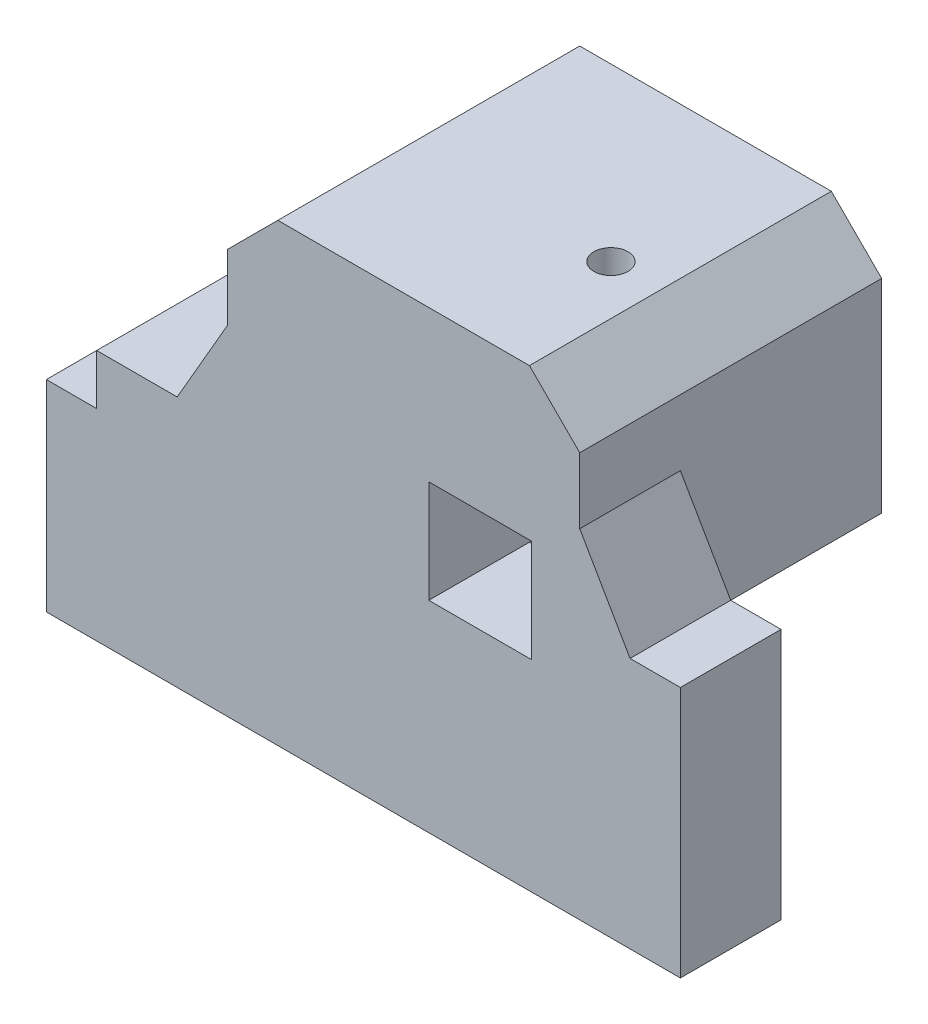
ISO-10303-21;
HEADER;
FILE_DESCRIPTION(('STEP AP214'),'2;1');
FILE_NAME('part.step','',(''),(''),'','','');
FILE_SCHEMA(('AUTOMOTIVE_DESIGN { 1 0 10303 214 1 1 1 1 }'));
ENDSEC;
DATA;
#1=APPLICATION_CONTEXT('core data for automotive mechanical design processes');
#2=APPLICATION_PROTOCOL_DEFINITION('international standard','automotive_design',2000,#1);
#3=PRODUCT_CONTEXT('',#1,'mechanical');
#4=PRODUCT('Part','Part','',(#3));
#5=PRODUCT_RELATED_PRODUCT_CATEGORY('part','',(#4));
#6=PRODUCT_DEFINITION_FORMATION('','',#4);
#7=PRODUCT_DEFINITION_CONTEXT('part definition',#1,'design');
#8=PRODUCT_DEFINITION('design','',#6,#7);
#9=PRODUCT_DEFINITION_SHAPE('','',#8);
#10=(LENGTH_UNIT() NAMED_UNIT(*) SI_UNIT(.MILLI.,.METRE.));
#11=(NAMED_UNIT(*) PLANE_ANGLE_UNIT() SI_UNIT($,.RADIAN.));
#12=(NAMED_UNIT(*) SI_UNIT($,.STERADIAN.) SOLID_ANGLE_UNIT());
#13=UNCERTAINTY_MEASURE_WITH_UNIT(LENGTH_MEASURE(1.E-05),#10,'distance_accuracy_value','');
#14=(GEOMETRIC_REPRESENTATION_CONTEXT(3) GLOBAL_UNCERTAINTY_ASSIGNED_CONTEXT((#13)) GLOBAL_UNIT_ASSIGNED_CONTEXT((#10,
#11,#12)) REPRESENTATION_CONTEXT('',''));
#15=CARTESIAN_POINT('',(0.,0.,0.));
#16=DIRECTION('',(0.,0.,1.));
#17=DIRECTION('',(1.,0.,0.));
#18=AXIS2_PLACEMENT_3D('',#15,#16,#17);
#19=CARTESIAN_POINT('',(-44.8113883008419,15.,0.));
#20=DIRECTION('',(0.,1.,0.));
#21=DIRECTION('',(-1.,0.,0.));
#22=AXIS2_PLACEMENT_3D('',#19,#20,#21);
#23=PLANE('',#22);
#24=DIRECTION('',(1.,0.,0.));
#25=VECTOR('',#24,1.);
#26=CARTESIAN_POINT('',(-44.8113883008419,15.,10.));
#27=LINE('',#26,#25);
#28=CARTESIAN_POINT('',(-29.,15.,10.));
#29=VERTEX_POINT('',#28);
#30=CARTESIAN_POINT('',(-21.,15.,10.));
#31=VERTEX_POINT('',#30);
#32=EDGE_CURVE('E327',#29,#31,#27,.T.);
#33=ORIENTED_EDGE('',*,*,#32,.T.);
#34=DIRECTION('',(0.,0.,-1.));
#35=VECTOR('',#34,1.);
#36=CARTESIAN_POINT('',(-21.,15.,0.));
#37=LINE('',#36,#35);
#38=CARTESIAN_POINT('',(-21.,15.,-5.));
#39=VERTEX_POINT('',#38);
#40=EDGE_CURVE('E374',#31,#39,#37,.T.);
#41=ORIENTED_EDGE('',*,*,#40,.T.);
#42=DIRECTION('',(1.,0.,0.));
#43=VECTOR('',#42,1.);
#44=CARTESIAN_POINT('',(-44.8113883008419,15.,-5.));
#45=LINE('',#44,#43);
#46=CARTESIAN_POINT('',(-29.,15.,-5.));
#47=VERTEX_POINT('',#46);
#48=EDGE_CURVE('E341',#47,#39,#45,.T.);
#49=ORIENTED_EDGE('',*,*,#48,.F.);
#50=DIRECTION('',(0.,0.,-1.));
#51=VECTOR('',#50,1.);
#52=CARTESIAN_POINT('',(-29.,15.,0.));
#53=LINE('',#52,#51);
#54=EDGE_CURVE('E326',#29,#47,#53,.T.);
#55=ORIENTED_EDGE('',*,*,#54,.F.);
#56=EDGE_LOOP('',(#33,#41,#49,#55));
#57=FACE_BOUND('',#56,.T.);
#58=ADVANCED_FACE('F45',(#57),#23,.T.);
#59=DIRECTION('',(1.,0.,0.));
#60=VECTOR('',#59,1.);
#61=CARTESIAN_POINT('',(-44.8113883008419,15.,0.));
#62=LINE('',#61,#60);
#63=CARTESIAN_POINT('',(24.,15.,0.));
#64=VERTEX_POINT('',#63);
#65=CARTESIAN_POINT('',(29.,15.,0.));
#66=VERTEX_POINT('',#65);
#67=EDGE_CURVE('E243',#64,#66,#62,.T.);
#68=ORIENTED_EDGE('',*,*,#67,.F.);
#69=DIRECTION('',(0.,0.,1.));
#70=VECTOR('',#69,1.);
#71=CARTESIAN_POINT('',(24.,15.,10.));
#72=LINE('',#71,#70);
#73=CARTESIAN_POINT('',(24.,15.,10.));
#74=VERTEX_POINT('',#73);
#75=EDGE_CURVE('E372',#64,#74,#72,.T.);
#76=ORIENTED_EDGE('',*,*,#75,.T.);
#77=CARTESIAN_POINT('',(29.,15.,10.));
#78=VERTEX_POINT('',#77);
#79=EDGE_CURVE('E340',#74,#78,#27,.T.);
#80=ORIENTED_EDGE('',*,*,#79,.T.);
#81=DIRECTION('',(0.,0.,1.));
#82=VECTOR('',#81,1.);
#83=CARTESIAN_POINT('',(29.,15.,0.));
#84=LINE('',#83,#82);
#85=EDGE_CURVE('E334',#66,#78,#84,.T.);
#86=ORIENTED_EDGE('',*,*,#85,.F.);
#87=EDGE_LOOP('',(#68,#76,#80,#86));
#88=FACE_BOUND('',#87,.T.);
#89=ADVANCED_FACE('F436',(#88),#23,.T.);
#90=CARTESIAN_POINT('',(-44.8113883008419,0.,-5.));
#91=DIRECTION('',(0.,0.,-1.));
#92=DIRECTION('',(-1.,0.,0.));
#93=AXIS2_PLACEMENT_3D('',#90,#91,#92);
#94=PLANE('',#93);
#95=ORIENTED_EDGE('',*,*,#48,.T.);
#96=DIRECTION('',(0.499999999999995,0.866025403784441,0.));
#97=VECTOR('',#96,1.);
#98=CARTESIAN_POINT('',(-21.,15.,-5.));
#99=LINE('',#98,#97);
#100=CARTESIAN_POINT('',(-16.,23.6602540378445,-5.));
#101=VERTEX_POINT('',#100);
#102=EDGE_CURVE('E54',#39,#101,#99,.T.);
#103=ORIENTED_EDGE('',*,*,#102,.T.);
#104=DIRECTION('',(0.,-1.,0.));
#105=VECTOR('',#104,1.);
#106=CARTESIAN_POINT('',(-16.,0.,-5.));
#107=LINE('',#106,#105);
#108=CARTESIAN_POINT('',(-16.,10.,-5.));
#109=VERTEX_POINT('',#108);
#110=EDGE_CURVE('E61',#101,#109,#107,.T.);
#111=ORIENTED_EDGE('',*,*,#110,.T.);
#112=DIRECTION('',(1.,0.,0.));
#113=VECTOR('',#112,1.);
#114=CARTESIAN_POINT('',(-44.8113883008419,10.,-5.));
#115=LINE('',#114,#113);
#116=CARTESIAN_POINT('',(-29.,10.,-5.));
#117=VERTEX_POINT('',#116);
#118=EDGE_CURVE('E337',#117,#109,#115,.T.);
#119=ORIENTED_EDGE('',*,*,#118,.F.);
#120=DIRECTION('',(0.,-1.,0.));
#121=VECTOR('',#120,1.);
#122=CARTESIAN_POINT('',(-29.,0.,-5.));
#123=LINE('',#122,#121);
#124=EDGE_CURVE('E324',#47,#117,#123,.T.);
#125=ORIENTED_EDGE('',*,*,#124,.F.);
#126=EDGE_LOOP('',(#95,#103,#111,#119,#125));
#127=FACE_BOUND('',#126,.T.);
#128=ADVANCED_FACE('F381',(#127),#94,.T.);
#129=CARTESIAN_POINT('',(-29.,-10.,5.));
#130=DIRECTION('',(1.,0.,0.));
#131=DIRECTION('',(0.,1.,0.));
#132=AXIS2_PLACEMENT_3D('',#129,#130,#131);
#133=PLANE('',#132);
#134=DIRECTION('',(0.,0.,1.));
#135=VECTOR('',#134,1.);
#136=CARTESIAN_POINT('',(-29.,10.,0.));
#137=LINE('',#136,#135);
#138=CARTESIAN_POINT('',(-29.,10.,0.));
#139=VERTEX_POINT('',#138);
#140=EDGE_CURVE('E346',#117,#139,#137,.T.);
#141=ORIENTED_EDGE('',*,*,#140,.T.);
#142=CARTESIAN_POINT('',(-29.,10.,9.99999999999999));
#143=VERTEX_POINT('',#142);
#144=EDGE_CURVE('E331',#139,#143,#137,.T.);
#145=ORIENTED_EDGE('',*,*,#144,.T.);
#146=DIRECTION('',(0.,1.,0.));
#147=VECTOR('',#146,1.);
#148=CARTESIAN_POINT('',(-29.,0.,10.));
#149=LINE('',#148,#147);
#150=EDGE_CURVE('E329',#143,#29,#149,.T.);
#151=ORIENTED_EDGE('',*,*,#150,.T.);
#152=ORIENTED_EDGE('',*,*,#54,.T.);
#153=ORIENTED_EDGE('',*,*,#124,.T.);
#154=EDGE_LOOP('',(#141,#145,#151,#152,#153));
#155=FACE_BOUND('',#154,.T.);
#156=ADVANCED_FACE('F393',(#155),#133,.F.);
#157=CARTESIAN_POINT('',(29.,-10.,5.));
#158=DIRECTION('',(-1.,0.,0.));
#159=DIRECTION('',(0.,-1.,0.));
#160=AXIS2_PLACEMENT_3D('',#157,#158,#159);
#161=PLANE('',#160);
#162=DIRECTION('',(0.,1.,0.));
#163=VECTOR('',#162,1.);
#164=CARTESIAN_POINT('',(29.,-10.,0.));
#165=LINE('',#164,#163);
#166=CARTESIAN_POINT('',(29.,-10.,0.));
#167=VERTEX_POINT('',#166);
#168=EDGE_CURVE('E349',#167,#66,#165,.T.);
#169=ORIENTED_EDGE('',*,*,#168,.T.);
#170=ORIENTED_EDGE('',*,*,#85,.T.);
#171=DIRECTION('',(0.,-1.,0.));
#172=VECTOR('',#171,1.);
#173=CARTESIAN_POINT('',(29.,0.,10.));
#174=LINE('',#173,#172);
#175=CARTESIAN_POINT('',(29.,-10.,9.99999999999999));
#176=VERTEX_POINT('',#175);
#177=EDGE_CURVE('E321',#78,#176,#174,.T.);
#178=ORIENTED_EDGE('',*,*,#177,.T.);
#179=DIRECTION('',(0.,0.,-1.));
#180=VECTOR('',#179,1.);
#181=CARTESIAN_POINT('',(29.,-10.,5.));
#182=LINE('',#181,#180);
#183=EDGE_CURVE('E268',#176,#167,#182,.T.);
#184=ORIENTED_EDGE('',*,*,#183,.T.);
#185=EDGE_LOOP('',(#169,#170,#178,#184));
#186=FACE_BOUND('',#185,.T.);
#187=ADVANCED_FACE('F453',(#186),#161,.F.);
#188=CARTESIAN_POINT('',(-29.,-10.,5.));
#189=DIRECTION('',(0.,1.,0.));
#190=DIRECTION('',(0.,0.,1.));
#191=AXIS2_PLACEMENT_3D('',#188,#189,#190);
#192=PLANE('',#191);
#193=CARTESIAN_POINT('',(-19.,-10.,4.99999999999999));
#194=DIRECTION('',(0.,-1.,0.));
#195=DIRECTION('',(0.,0.,-1.));
#196=AXIS2_PLACEMENT_3D('',#193,#194,#195);
#197=CIRCLE('',#196,2.);
#198=CARTESIAN_POINT('',(-19.,-10.,3.));
#199=VERTEX_POINT('',#198);
#200=EDGE_CURVE('E275',#199,#199,#197,.T.);
#201=ORIENTED_EDGE('',*,*,#200,.F.);
#202=EDGE_LOOP('',(#201));
#203=FACE_BOUND('',#202,.T.);
#204=CARTESIAN_POINT('',(11.,-10.,4.99999999999999));
#205=DIRECTION('',(0.,-1.,0.));
#206=DIRECTION('',(0.,0.,-1.));
#207=AXIS2_PLACEMENT_3D('',#204,#205,#206);
#208=CIRCLE('',#207,2.);
#209=CARTESIAN_POINT('',(11.,-10.,3.));
#210=VERTEX_POINT('',#209);
#211=EDGE_CURVE('E278',#210,#210,#208,.T.);
#212=ORIENTED_EDGE('',*,*,#211,.F.);
#213=EDGE_LOOP('',(#212));
#214=FACE_BOUND('',#213,.T.);
#215=ORIENTED_EDGE('',*,*,#183,.F.);
#216=DIRECTION('',(1.,0.,0.));
#217=VECTOR('',#216,1.);
#218=CARTESIAN_POINT('',(0.,-10.,9.99999999999999));
#219=LINE('',#218,#217);
#220=CARTESIAN_POINT('',(-34.,-10.,9.99999999999999));
#221=VERTEX_POINT('',#220);
#222=EDGE_CURVE('E301',#221,#176,#219,.T.);
#223=ORIENTED_EDGE('',*,*,#222,.F.);
#224=DIRECTION('',(0.,0.,1.));
#225=VECTOR('',#224,1.);
#226=CARTESIAN_POINT('',(-34.,-10.,0.));
#227=LINE('',#226,#225);
#228=CARTESIAN_POINT('',(-34.,-10.,4.99999999999999));
#229=VERTEX_POINT('',#228);
#230=EDGE_CURVE('E315',#229,#221,#227,.T.);
#231=ORIENTED_EDGE('',*,*,#230,.F.);
#232=DIRECTION('',(-0.707106781186548,0.,0.707106781186547));
#233=VECTOR('',#232,1.);
#234=CARTESIAN_POINT('',(-14.5,-10.,-14.5));
#235=LINE('',#234,#233);
#236=CARTESIAN_POINT('',(-29.,-10.,0.));
#237=VERTEX_POINT('',#236);
#238=EDGE_CURVE('E308',#237,#229,#235,.T.);
#239=ORIENTED_EDGE('',*,*,#238,.F.);
#240=DIRECTION('',(1.,0.,0.));
#241=VECTOR('',#240,1.);
#242=CARTESIAN_POINT('',(-29.,-10.,0.));
#243=LINE('',#242,#241);
#244=EDGE_CURVE('E358',#237,#167,#243,.T.);
#245=ORIENTED_EDGE('',*,*,#244,.T.);
#246=EDGE_LOOP('',(#215,#223,#231,#239,#245));
#247=FACE_BOUND('',#246,.T.);
#248=ADVANCED_FACE('F414',(#203,#214,#247),#192,.F.);
#249=CARTESIAN_POINT('',(0.,0.,0.));
#250=DIRECTION('',(0.,0.,-1.));
#251=DIRECTION('',(-1.,0.,0.));
#252=AXIS2_PLACEMENT_3D('',#249,#250,#251);
#253=PLANE('',#252);
#254=ORIENTED_EDGE('',*,*,#168,.F.);
#255=ORIENTED_EDGE('',*,*,#244,.F.);
#256=DIRECTION('',(0.,-1.,0.));
#257=VECTOR('',#256,1.);
#258=CARTESIAN_POINT('',(-29.,-10.,0.));
#259=LINE('',#258,#257);
#260=EDGE_CURVE('E355',#139,#237,#259,.T.);
#261=ORIENTED_EDGE('',*,*,#260,.F.);
#262=DIRECTION('',(-1.,0.,0.));
#263=VECTOR('',#262,1.);
#264=CARTESIAN_POINT('',(-29.,10.,0.));
#265=LINE('',#264,#263);
#266=CARTESIAN_POINT('',(4.,10.,0.));
#267=VERTEX_POINT('',#266);
#268=EDGE_CURVE('E352',#267,#139,#265,.T.);
#269=ORIENTED_EDGE('',*,*,#268,.F.);
#270=CARTESIAN_POINT('',(14.2,10.,0.));
#271=VERTEX_POINT('',#270);
#272=EDGE_CURVE('E356',#271,#267,#265,.T.);
#273=ORIENTED_EDGE('',*,*,#272,.F.);
#274=CARTESIAN_POINT('',(19.,10.,0.));
#275=VERTEX_POINT('',#274);
#276=EDGE_CURVE('E353',#275,#271,#265,.T.);
#277=ORIENTED_EDGE('',*,*,#276,.F.);
#278=DIRECTION('',(0.,-1.,0.));
#279=VECTOR('',#278,1.);
#280=CARTESIAN_POINT('',(19.,20.,0.));
#281=LINE('',#280,#279);
#282=CARTESIAN_POINT('',(19.,23.6602540378445,0.));
#283=VERTEX_POINT('',#282);
#284=EDGE_CURVE('E241',#283,#275,#281,.T.);
#285=ORIENTED_EDGE('',*,*,#284,.F.);
#286=DIRECTION('',(-0.499999999999994,0.866025403784442,0.));
#287=VECTOR('',#286,1.);
#288=CARTESIAN_POINT('',(19.,23.6602540378445,0.));
#289=LINE('',#288,#287);
#290=EDGE_CURVE('E378',#283,#64,#289,.F.);
#291=ORIENTED_EDGE('',*,*,#290,.T.);
#292=ORIENTED_EDGE('',*,*,#67,.T.);
#293=EDGE_LOOP('',(#254,#255,#261,#269,#273,#277,#285,#291,#292));
#294=FACE_BOUND('',#293,.T.);
#295=ADVANCED_FACE('F405',(#294),#253,.T.);
#296=CARTESIAN_POINT('',(-44.8113883008419,0.,10.));
#297=DIRECTION('',(0.,0.,1.));
#298=DIRECTION('',(1.,0.,0.));
#299=AXIS2_PLACEMENT_3D('',#296,#297,#298);
#300=PLANE('',#299);
#301=ORIENTED_EDGE('',*,*,#79,.F.);
#302=DIRECTION('',(0.499999999999994,-0.866025403784442,0.));
#303=VECTOR('',#302,1.);
#304=CARTESIAN_POINT('',(19.,23.6602540378445,10.));
#305=LINE('',#304,#303);
#306=CARTESIAN_POINT('',(19.,23.6602540378445,10.));
#307=VERTEX_POINT('',#306);
#308=EDGE_CURVE('E204',#74,#307,#305,.F.);
#309=ORIENTED_EDGE('',*,*,#308,.T.);
#310=DIRECTION('',(0.,1.,0.));
#311=VECTOR('',#310,1.);
#312=CARTESIAN_POINT('',(19.,15.,10.));
#313=LINE('',#312,#311);
#314=CARTESIAN_POINT('',(19.,30.2,10.));
#315=VERTEX_POINT('',#314);
#316=EDGE_CURVE('E194',#307,#315,#313,.T.);
#317=ORIENTED_EDGE('',*,*,#316,.T.);
#318=DIRECTION('',(-0.70710678118655,0.707106781186545,0.));
#319=VECTOR('',#318,1.);
#320=CARTESIAN_POINT('',(19.,30.2,10.));
#321=LINE('',#320,#319);
#322=CARTESIAN_POINT('',(14.,35.2,10.));
#323=VERTEX_POINT('',#322);
#324=EDGE_CURVE('E201',#315,#323,#321,.T.);
#325=ORIENTED_EDGE('',*,*,#324,.T.);
#326=DIRECTION('',(-1.,0.,0.));
#327=VECTOR('',#326,1.);
#328=CARTESIAN_POINT('',(14.,35.2,10.));
#329=LINE('',#328,#327);
#330=CARTESIAN_POINT('',(-11.,35.2,10.));
#331=VERTEX_POINT('',#330);
#332=EDGE_CURVE('E221',#323,#331,#329,.T.);
#333=ORIENTED_EDGE('',*,*,#332,.T.);
#334=DIRECTION('',(-0.707106781186547,-0.707106781186548,0.));
#335=VECTOR('',#334,1.);
#336=CARTESIAN_POINT('',(-11.,35.2,10.));
#337=LINE('',#336,#335);
#338=CARTESIAN_POINT('',(-16.,30.2,10.));
#339=VERTEX_POINT('',#338);
#340=EDGE_CURVE('E223',#331,#339,#337,.T.);
#341=ORIENTED_EDGE('',*,*,#340,.T.);
#342=DIRECTION('',(0.,-1.,0.));
#343=VECTOR('',#342,1.);
#344=CARTESIAN_POINT('',(-16.,30.2,10.));
#345=LINE('',#344,#343);
#346=CARTESIAN_POINT('',(-16.,23.6602540378445,10.));
#347=VERTEX_POINT('',#346);
#348=EDGE_CURVE('E228',#339,#347,#345,.T.);
#349=ORIENTED_EDGE('',*,*,#348,.T.);
#350=DIRECTION('',(-0.499999999999995,-0.866025403784441,0.));
#351=VECTOR('',#350,1.);
#352=CARTESIAN_POINT('',(-21.,15.,10.));
#353=LINE('',#352,#351);
#354=EDGE_CURVE('E11',#347,#31,#353,.T.);
#355=ORIENTED_EDGE('',*,*,#354,.T.);
#356=ORIENTED_EDGE('',*,*,#32,.F.);
#357=ORIENTED_EDGE('',*,*,#150,.F.);
#358=DIRECTION('',(1.,0.,0.));
#359=VECTOR('',#358,1.);
#360=CARTESIAN_POINT('',(0.,10.,9.99999999999999));
#361=LINE('',#360,#359);
#362=CARTESIAN_POINT('',(-34.,10.,9.99999999999999));
#363=VERTEX_POINT('',#362);
#364=EDGE_CURVE('E304',#363,#143,#361,.T.);
#365=ORIENTED_EDGE('',*,*,#364,.F.);
#366=DIRECTION('',(0.,-1.,0.));
#367=VECTOR('',#366,1.);
#368=CARTESIAN_POINT('',(-34.,10.,9.99999999999999));
#369=LINE('',#368,#367);
#370=EDGE_CURVE('E312',#363,#221,#369,.T.);
#371=ORIENTED_EDGE('',*,*,#370,.T.);
#372=ORIENTED_EDGE('',*,*,#222,.T.);
#373=ORIENTED_EDGE('',*,*,#177,.F.);
#374=EDGE_LOOP('',(#301,#309,#317,#325,#333,#341,#349,#355,#356,#357,#365,#371,#372,#373));
#375=FACE_BOUND('',#374,.T.);
#376=DIRECTION('',(0.,1.,0.));
#377=VECTOR('',#376,1.);
#378=CARTESIAN_POINT('',(14.2,0.,10.));
#379=LINE('',#378,#377);
#380=CARTESIAN_POINT('',(14.2,10.,9.99999999999999));
#381=VERTEX_POINT('',#380);
#382=CARTESIAN_POINT('',(14.2,20.2,10.));
#383=VERTEX_POINT('',#382);
#384=EDGE_CURVE('E287',#381,#383,#379,.T.);
#385=ORIENTED_EDGE('',*,*,#384,.F.);
#386=DIRECTION('',(1.,0.,0.));
#387=VECTOR('',#386,1.);
#388=CARTESIAN_POINT('',(-29.,10.,9.99999999999999));
#389=LINE('',#388,#387);
#390=CARTESIAN_POINT('',(4.,10.,9.99999999999999));
#391=VERTEX_POINT('',#390);
#392=EDGE_CURVE('E274',#391,#381,#389,.T.);
#393=ORIENTED_EDGE('',*,*,#392,.F.);
#394=DIRECTION('',(0.,1.,0.));
#395=VECTOR('',#394,1.);
#396=CARTESIAN_POINT('',(4.,0.,10.));
#397=LINE('',#396,#395);
#398=CARTESIAN_POINT('',(4.,20.2,10.));
#399=VERTEX_POINT('',#398);
#400=EDGE_CURVE('E285',#391,#399,#397,.T.);
#401=ORIENTED_EDGE('',*,*,#400,.T.);
#402=DIRECTION('',(1.,0.,0.));
#403=VECTOR('',#402,1.);
#404=CARTESIAN_POINT('',(4.,20.2,10.));
#405=LINE('',#404,#403);
#406=EDGE_CURVE('E230',#399,#383,#405,.T.);
#407=ORIENTED_EDGE('',*,*,#406,.T.);
#408=EDGE_LOOP('',(#385,#393,#401,#407));
#409=FACE_BOUND('',#408,.T.);
#410=ADVANCED_FACE('F197',(#375,#409),#300,.T.);
#411=CARTESIAN_POINT('',(-44.8113883008419,10.,0.));
#412=DIRECTION('',(0.,-1.,0.));
#413=DIRECTION('',(1.,0.,0.));
#414=AXIS2_PLACEMENT_3D('',#411,#412,#413);
#415=PLANE('',#414);
#416=DIRECTION('',(0.,0.,-1.));
#417=VECTOR('',#416,1.);
#418=CARTESIAN_POINT('',(19.,10.,0.));
#419=LINE('',#418,#417);
#420=CARTESIAN_POINT('',(19.,10.,-20.));
#421=VERTEX_POINT('',#420);
#422=EDGE_CURVE('E239',#275,#421,#419,.T.);
#423=ORIENTED_EDGE('',*,*,#422,.F.);
#424=ORIENTED_EDGE('',*,*,#276,.T.);
#425=DIRECTION('',(0.,0.,1.));
#426=VECTOR('',#425,1.);
#427=CARTESIAN_POINT('',(14.2,10.,-5.));
#428=LINE('',#427,#426);
#429=CARTESIAN_POINT('',(14.2,10.,-15.));
#430=VERTEX_POINT('',#429);
#431=EDGE_CURVE('E290',#430,#271,#428,.T.);
#432=ORIENTED_EDGE('',*,*,#431,.F.);
#433=DIRECTION('',(-1.,0.,0.));
#434=VECTOR('',#433,1.);
#435=CARTESIAN_POINT('',(0.,10.,-15.));
#436=LINE('',#435,#434);
#437=CARTESIAN_POINT('',(4.,10.,-15.));
#438=VERTEX_POINT('',#437);
#439=EDGE_CURVE('E245',#430,#438,#436,.T.);
#440=ORIENTED_EDGE('',*,*,#439,.T.);
#441=DIRECTION('',(0.,0.,1.));
#442=VECTOR('',#441,1.);
#443=CARTESIAN_POINT('',(4.,10.,-5.));
#444=LINE('',#443,#442);
#445=EDGE_CURVE('E295',#438,#267,#444,.T.);
#446=ORIENTED_EDGE('',*,*,#445,.T.);
#447=ORIENTED_EDGE('',*,*,#268,.T.);
#448=ORIENTED_EDGE('',*,*,#140,.F.);
#449=ORIENTED_EDGE('',*,*,#118,.T.);
#450=DIRECTION('',(0.,0.,1.));
#451=VECTOR('',#450,1.);
#452=CARTESIAN_POINT('',(-16.,10.,-15.));
#453=LINE('',#452,#451);
#454=CARTESIAN_POINT('',(-16.,10.,-20.));
#455=VERTEX_POINT('',#454);
#456=EDGE_CURVE('E266',#455,#109,#453,.T.);
#457=ORIENTED_EDGE('',*,*,#456,.F.);
#458=DIRECTION('',(-1.,0.,0.));
#459=VECTOR('',#458,1.);
#460=CARTESIAN_POINT('',(0.,10.,-20.));
#461=LINE('',#460,#459);
#462=EDGE_CURVE('E246',#421,#455,#461,.T.);
#463=ORIENTED_EDGE('',*,*,#462,.F.);
#464=EDGE_LOOP('',(#423,#424,#432,#440,#446,#447,#448,#449,#457,#463));
#465=FACE_BOUND('',#464,.T.);
#466=ADVANCED_FACE('F398',(#465),#415,.T.);
#467=CARTESIAN_POINT('',(0.,10.,0.));
#468=DIRECTION('',(0.,-1.,0.));
#469=DIRECTION('',(0.,0.,-1.));
#470=AXIS2_PLACEMENT_3D('',#467,#468,#469);
#471=PLANE('',#470);
#472=ORIENTED_EDGE('',*,*,#364,.T.);
#473=ORIENTED_EDGE('',*,*,#144,.F.);
#474=DIRECTION('',(-0.707106781186548,0.,0.707106781186547));
#475=VECTOR('',#474,1.);
#476=CARTESIAN_POINT('',(-14.5,10.,-14.5));
#477=LINE('',#476,#475);
#478=CARTESIAN_POINT('',(-34.,10.,4.99999999999999));
#479=VERTEX_POINT('',#478);
#480=EDGE_CURVE('E310',#139,#479,#477,.T.);
#481=ORIENTED_EDGE('',*,*,#480,.T.);
#482=DIRECTION('',(0.,0.,1.));
#483=VECTOR('',#482,1.);
#484=CARTESIAN_POINT('',(-34.,10.,0.));
#485=LINE('',#484,#483);
#486=EDGE_CURVE('E307',#479,#363,#485,.T.);
#487=ORIENTED_EDGE('',*,*,#486,.T.);
#488=EDGE_LOOP('',(#472,#473,#481,#487));
#489=FACE_BOUND('',#488,.T.);
#490=ADVANCED_FACE('F423',(#489),#471,.F.);
#491=CARTESIAN_POINT('',(-14.5,10.,-14.5));
#492=DIRECTION('',(0.707106781186547,0.,0.707106781186548));
#493=DIRECTION('',(0.707106781186548,0.,-0.707106781186547));
#494=AXIS2_PLACEMENT_3D('',#491,#492,#493);
#495=PLANE('',#494);
#496=ORIENTED_EDGE('',*,*,#238,.T.);
#497=DIRECTION('',(0.,-1.,0.));
#498=VECTOR('',#497,1.);
#499=CARTESIAN_POINT('',(-34.,10.,4.99999999999999));
#500=LINE('',#499,#498);
#501=EDGE_CURVE('E318',#479,#229,#500,.T.);
#502=ORIENTED_EDGE('',*,*,#501,.F.);
#503=ORIENTED_EDGE('',*,*,#480,.F.);
#504=ORIENTED_EDGE('',*,*,#260,.T.);
#505=EDGE_LOOP('',(#496,#502,#503,#504));
#506=FACE_BOUND('',#505,.T.);
#507=ADVANCED_FACE('F410',(#506),#495,.F.);
#508=CARTESIAN_POINT('',(-34.,10.,0.));
#509=DIRECTION('',(1.,0.,0.));
#510=DIRECTION('',(0.,0.,-1.));
#511=AXIS2_PLACEMENT_3D('',#508,#509,#510);
#512=PLANE('',#511);
#513=ORIENTED_EDGE('',*,*,#230,.T.);
#514=ORIENTED_EDGE('',*,*,#370,.F.);
#515=ORIENTED_EDGE('',*,*,#486,.F.);
#516=ORIENTED_EDGE('',*,*,#501,.T.);
#517=EDGE_LOOP('',(#513,#514,#515,#516));
#518=FACE_BOUND('',#517,.T.);
#519=ADVANCED_FACE('F418',(#518),#512,.F.);
#520=CARTESIAN_POINT('',(14.2,0.,-5.));
#521=DIRECTION('',(1.,0.,0.));
#522=DIRECTION('',(0.,0.,-1.));
#523=AXIS2_PLACEMENT_3D('',#520,#521,#522);
#524=PLANE('',#523);
#525=DIRECTION('',(0.,0.,1.));
#526=VECTOR('',#525,1.);
#527=CARTESIAN_POINT('',(14.2,20.2,-5.));
#528=LINE('',#527,#526);
#529=CARTESIAN_POINT('',(14.2,20.2,-15.));
#530=VERTEX_POINT('',#529);
#531=EDGE_CURVE('E298',#530,#383,#528,.T.);
#532=ORIENTED_EDGE('',*,*,#531,.F.);
#533=DIRECTION('',(0.,1.,0.));
#534=VECTOR('',#533,1.);
#535=CARTESIAN_POINT('',(14.2,0.,-15.));
#536=LINE('',#535,#534);
#537=EDGE_CURVE('E255',#430,#530,#536,.T.);
#538=ORIENTED_EDGE('',*,*,#537,.F.);
#539=ORIENTED_EDGE('',*,*,#431,.T.);
#540=EDGE_CURVE('E294',#271,#381,#428,.T.);
#541=ORIENTED_EDGE('',*,*,#540,.T.);
#542=ORIENTED_EDGE('',*,*,#384,.T.);
#543=EDGE_LOOP('',(#532,#538,#539,#541,#542));
#544=FACE_BOUND('',#543,.T.);
#545=ADVANCED_FACE('F507',(#544),#524,.F.);
#546=CARTESIAN_POINT('',(0.,20.2,-5.));
#547=DIRECTION('',(0.,1.,0.));
#548=DIRECTION('',(0.,0.,1.));
#549=AXIS2_PLACEMENT_3D('',#546,#547,#548);
#550=PLANE('',#549);
#551=CARTESIAN_POINT('',(9.1,20.2,-3.));
#552=DIRECTION('',(0.,1.,0.));
#553=DIRECTION('',(0.,0.,1.));
#554=AXIS2_PLACEMENT_3D('',#551,#552,#553);
#555=CIRCLE('',#554,1.7);
#556=CARTESIAN_POINT('',(9.1,20.2,-1.3));
#557=VERTEX_POINT('',#556);
#558=EDGE_CURVE('E236',#557,#557,#555,.T.);
#559=ORIENTED_EDGE('',*,*,#558,.T.);
#560=EDGE_LOOP('',(#559));
#561=FACE_BOUND('',#560,.T.);
#562=ORIENTED_EDGE('',*,*,#531,.T.);
#563=ORIENTED_EDGE('',*,*,#406,.F.);
#564=DIRECTION('',(0.,0.,1.));
#565=VECTOR('',#564,1.);
#566=CARTESIAN_POINT('',(4.,20.2,-5.));
#567=LINE('',#566,#565);
#568=CARTESIAN_POINT('',(4.,20.2,-15.));
#569=VERTEX_POINT('',#568);
#570=EDGE_CURVE('E293',#569,#399,#567,.T.);
#571=ORIENTED_EDGE('',*,*,#570,.F.);
#572=DIRECTION('',(-1.,0.,0.));
#573=VECTOR('',#572,1.);
#574=CARTESIAN_POINT('',(0.,20.2,-15.));
#575=LINE('',#574,#573);
#576=EDGE_CURVE('E260',#530,#569,#575,.T.);
#577=ORIENTED_EDGE('',*,*,#576,.F.);
#578=EDGE_LOOP('',(#562,#563,#571,#577));
#579=FACE_BOUND('',#578,.T.);
#580=ADVANCED_FACE('F504',(#561,#579),#550,.F.);
#581=CARTESIAN_POINT('',(4.,0.,-5.));
#582=DIRECTION('',(1.,0.,0.));
#583=DIRECTION('',(0.,0.,-1.));
#584=AXIS2_PLACEMENT_3D('',#581,#582,#583);
#585=PLANE('',#584);
#586=ORIENTED_EDGE('',*,*,#570,.T.);
#587=ORIENTED_EDGE('',*,*,#400,.F.);
#588=EDGE_CURVE('E289',#267,#391,#444,.T.);
#589=ORIENTED_EDGE('',*,*,#588,.F.);
#590=ORIENTED_EDGE('',*,*,#445,.F.);
#591=DIRECTION('',(0.,-1.,0.));
#592=VECTOR('',#591,1.);
#593=CARTESIAN_POINT('',(4.,0.,-15.));
#594=LINE('',#593,#592);
#595=EDGE_CURVE('E263',#569,#438,#594,.T.);
#596=ORIENTED_EDGE('',*,*,#595,.F.);
#597=EDGE_LOOP('',(#586,#587,#589,#590,#596));
#598=FACE_BOUND('',#597,.T.);
#599=ADVANCED_FACE('F495',(#598),#585,.T.);
#600=CARTESIAN_POINT('',(-16.,0.,-5.));
#601=DIRECTION('',(1.,0.,0.));
#602=DIRECTION('',(0.,1.,0.));
#603=AXIS2_PLACEMENT_3D('',#600,#601,#602);
#604=PLANE('',#603);
#605=ORIENTED_EDGE('',*,*,#110,.F.);
#606=DIRECTION('',(0.,0.,1.));
#607=VECTOR('',#606,1.);
#608=CARTESIAN_POINT('',(-16.,23.6602540378445,-5.));
#609=LINE('',#608,#607);
#610=EDGE_CURVE('E66',#101,#347,#609,.T.);
#611=ORIENTED_EDGE('',*,*,#610,.T.);
#612=ORIENTED_EDGE('',*,*,#348,.F.);
#613=DIRECTION('',(0.,0.,-1.));
#614=VECTOR('',#613,1.);
#615=CARTESIAN_POINT('',(-16.,30.2,-5.));
#616=LINE('',#615,#614);
#617=CARTESIAN_POINT('',(-16.,30.2,-20.));
#618=VERTEX_POINT('',#617);
#619=EDGE_CURVE('E368',#339,#618,#616,.T.);
#620=ORIENTED_EDGE('',*,*,#619,.T.);
#621=DIRECTION('',(0.,1.,0.));
#622=VECTOR('',#621,1.);
#623=CARTESIAN_POINT('',(-16.,0.,-20.));
#624=LINE('',#623,#622);
#625=EDGE_CURVE('E248',#455,#618,#624,.T.);
#626=ORIENTED_EDGE('',*,*,#625,.F.);
#627=ORIENTED_EDGE('',*,*,#456,.T.);
#628=EDGE_LOOP('',(#605,#611,#612,#620,#626,#627));
#629=FACE_BOUND('',#628,.T.);
#630=ADVANCED_FACE('F521',(#629),#604,.F.);
#631=CARTESIAN_POINT('',(0.,35.2,-5.));
#632=DIRECTION('',(0.,-1.,0.));
#633=DIRECTION('',(0.,0.,-1.));
#634=AXIS2_PLACEMENT_3D('',#631,#632,#633);
#635=PLANE('',#634);
#636=CARTESIAN_POINT('',(9.1,35.2,-3.));
#637=DIRECTION('',(0.,1.,0.));
#638=DIRECTION('',(0.,0.,1.));
#639=AXIS2_PLACEMENT_3D('',#636,#637,#638);
#640=CIRCLE('',#639,1.7);
#641=CARTESIAN_POINT('',(9.1,35.2,-1.3));
#642=VERTEX_POINT('',#641);
#643=EDGE_CURVE('E233',#642,#642,#640,.T.);
#644=ORIENTED_EDGE('',*,*,#643,.F.);
#645=EDGE_LOOP('',(#644));
#646=FACE_BOUND('',#645,.T.);
#647=DIRECTION('',(0.,0.,1.));
#648=VECTOR('',#647,1.);
#649=CARTESIAN_POINT('',(-11.,35.2,-5.));
#650=LINE('',#649,#648);
#651=CARTESIAN_POINT('',(-11.,35.2,-20.));
#652=VERTEX_POINT('',#651);
#653=EDGE_CURVE('E217',#652,#331,#650,.T.);
#654=ORIENTED_EDGE('',*,*,#653,.T.);
#655=ORIENTED_EDGE('',*,*,#332,.F.);
#656=DIRECTION('',(0.,0.,-1.));
#657=VECTOR('',#656,1.);
#658=CARTESIAN_POINT('',(14.,35.2,-20.));
#659=LINE('',#658,#657);
#660=CARTESIAN_POINT('',(14.,35.2,-20.));
#661=VERTEX_POINT('',#660);
#662=EDGE_CURVE('E220',#323,#661,#659,.T.);
#663=ORIENTED_EDGE('',*,*,#662,.T.);
#664=DIRECTION('',(1.,0.,0.));
#665=VECTOR('',#664,1.);
#666=CARTESIAN_POINT('',(0.,35.2,-20.));
#667=LINE('',#666,#665);
#668=EDGE_CURVE('E251',#652,#661,#667,.T.);
#669=ORIENTED_EDGE('',*,*,#668,.F.);
#670=EDGE_LOOP('',(#654,#655,#663,#669));
#671=FACE_BOUND('',#670,.T.);
#672=ADVANCED_FACE('F524',(#646,#671),#635,.F.);
#673=CARTESIAN_POINT('',(19.,0.,-5.));
#674=DIRECTION('',(1.,0.,0.));
#675=DIRECTION('',(0.,1.,0.));
#676=AXIS2_PLACEMENT_3D('',#673,#674,#675);
#677=PLANE('',#676);
#678=ORIENTED_EDGE('',*,*,#316,.F.);
#679=DIRECTION('',(0.,0.,-1.));
#680=VECTOR('',#679,1.);
#681=CARTESIAN_POINT('',(19.,23.6602540378445,0.));
#682=LINE('',#681,#680);
#683=EDGE_CURVE('E370',#307,#283,#682,.T.);
#684=ORIENTED_EDGE('',*,*,#683,.T.);
#685=ORIENTED_EDGE('',*,*,#284,.T.);
#686=ORIENTED_EDGE('',*,*,#422,.T.);
#687=DIRECTION('',(0.,-1.,0.));
#688=VECTOR('',#687,1.);
#689=CARTESIAN_POINT('',(19.,0.,-20.));
#690=LINE('',#689,#688);
#691=CARTESIAN_POINT('',(19.,30.2,-20.));
#692=VERTEX_POINT('',#691);
#693=EDGE_CURVE('E214',#692,#421,#690,.T.);
#694=ORIENTED_EDGE('',*,*,#693,.F.);
#695=DIRECTION('',(0.,0.,1.));
#696=VECTOR('',#695,1.);
#697=CARTESIAN_POINT('',(19.,30.2,5.));
#698=LINE('',#697,#696);
#699=EDGE_CURVE('E211',#692,#315,#698,.T.);
#700=ORIENTED_EDGE('',*,*,#699,.T.);
#701=EDGE_LOOP('',(#678,#684,#685,#686,#694,#700));
#702=FACE_BOUND('',#701,.T.);
#703=ADVANCED_FACE('F212',(#702),#677,.T.);
#704=CARTESIAN_POINT('',(0.,10.,-5.));
#705=DIRECTION('',(0.,1.,0.));
#706=DIRECTION('',(0.,0.,1.));
#707=AXIS2_PLACEMENT_3D('',#704,#705,#706);
#708=PLANE('',#707);
#709=ORIENTED_EDGE('',*,*,#588,.T.);
#710=ORIENTED_EDGE('',*,*,#392,.T.);
#711=ORIENTED_EDGE('',*,*,#540,.F.);
#712=ORIENTED_EDGE('',*,*,#272,.T.);
#713=EDGE_LOOP('',(#709,#710,#711,#712));
#714=FACE_BOUND('',#713,.T.);
#715=ADVANCED_FACE('F491',(#714),#708,.T.);
#716=CARTESIAN_POINT('',(11.,0.,4.99999999999999));
#717=DIRECTION('',(0.,-1.,0.));
#718=DIRECTION('',(0.,0.,-1.));
#719=AXIS2_PLACEMENT_3D('',#716,#717,#718);
#720=CYLINDRICAL_SURFACE('',#719,2.);
#721=CARTESIAN_POINT('',(11.,0.,4.99999999999999));
#722=DIRECTION('',(0.,-1.,0.));
#723=DIRECTION('',(0.,0.,-1.));
#724=AXIS2_PLACEMENT_3D('',#721,#722,#723);
#725=CIRCLE('',#724,2.);
#726=CARTESIAN_POINT('',(11.,0.,3.));
#727=VERTEX_POINT('',#726);
#728=EDGE_CURVE('E270',#727,#727,#725,.T.);
#729=ORIENTED_EDGE('',*,*,#728,.F.);
#730=EDGE_LOOP('',(#729));
#731=FACE_BOUND('',#730,.T.);
#732=ORIENTED_EDGE('',*,*,#211,.T.);
#733=EDGE_LOOP('',(#732));
#734=FACE_BOUND('',#733,.T.);
#735=ADVANCED_FACE('F529',(#731,#734),#720,.F.);
#736=CARTESIAN_POINT('',(11.,0.,4.99999999999999));
#737=DIRECTION('',(0.,-1.,0.));
#738=DIRECTION('',(0.,0.,-1.));
#739=AXIS2_PLACEMENT_3D('',#736,#737,#738);
#740=PLANE('',#739);
#741=ORIENTED_EDGE('',*,*,#728,.T.);
#742=EDGE_LOOP('',(#741));
#743=FACE_BOUND('',#742,.T.);
#744=ADVANCED_FACE('F533',(#743),#740,.T.);
#745=CARTESIAN_POINT('',(-19.,0.,4.99999999999999));
#746=DIRECTION('',(0.,-1.,0.));
#747=DIRECTION('',(0.,0.,-1.));
#748=AXIS2_PLACEMENT_3D('',#745,#746,#747);
#749=CYLINDRICAL_SURFACE('',#748,2.);
#750=CARTESIAN_POINT('',(-19.,0.,4.99999999999999));
#751=DIRECTION('',(0.,-1.,0.));
#752=DIRECTION('',(0.,0.,-1.));
#753=AXIS2_PLACEMENT_3D('',#750,#751,#752);
#754=CIRCLE('',#753,2.);
#755=CARTESIAN_POINT('',(-19.,0.,3.));
#756=VERTEX_POINT('',#755);
#757=EDGE_CURVE('E271',#756,#756,#754,.T.);
#758=ORIENTED_EDGE('',*,*,#757,.F.);
#759=EDGE_LOOP('',(#758));
#760=FACE_BOUND('',#759,.T.);
#761=ORIENTED_EDGE('',*,*,#200,.T.);
#762=EDGE_LOOP('',(#761));
#763=FACE_BOUND('',#762,.T.);
#764=ADVANCED_FACE('F539',(#760,#763),#749,.F.);
#765=CARTESIAN_POINT('',(-19.,0.,4.99999999999999));
#766=DIRECTION('',(0.,-1.,0.));
#767=DIRECTION('',(0.,0.,-1.));
#768=AXIS2_PLACEMENT_3D('',#765,#766,#767);
#769=PLANE('',#768);
#770=ORIENTED_EDGE('',*,*,#757,.T.);
#771=EDGE_LOOP('',(#770));
#772=FACE_BOUND('',#771,.T.);
#773=ADVANCED_FACE('F546',(#772),#769,.T.);
#774=CARTESIAN_POINT('',(0.,0.,-15.));
#775=DIRECTION('',(0.,0.,-1.));
#776=DIRECTION('',(-1.,0.,0.));
#777=AXIS2_PLACEMENT_3D('',#774,#775,#776);
#778=PLANE('',#777);
#779=ORIENTED_EDGE('',*,*,#439,.F.);
#780=ORIENTED_EDGE('',*,*,#537,.T.);
#781=ORIENTED_EDGE('',*,*,#576,.T.);
#782=ORIENTED_EDGE('',*,*,#595,.T.);
#783=EDGE_LOOP('',(#779,#780,#781,#782));
#784=FACE_BOUND('',#783,.T.);
#785=ADVANCED_FACE('F500',(#784),#778,.F.);
#786=CARTESIAN_POINT('',(0.,0.,-20.));
#787=DIRECTION('',(0.,0.,-1.));
#788=DIRECTION('',(-1.,0.,0.));
#789=AXIS2_PLACEMENT_3D('',#786,#787,#788);
#790=PLANE('',#789);
#791=ORIENTED_EDGE('',*,*,#693,.T.);
#792=ORIENTED_EDGE('',*,*,#462,.T.);
#793=ORIENTED_EDGE('',*,*,#625,.T.);
#794=DIRECTION('',(-0.707106781186547,-0.707106781186548,0.));
#795=VECTOR('',#794,1.);
#796=CARTESIAN_POINT('',(-23.1,23.1,-20.));
#797=LINE('',#796,#795);
#798=EDGE_CURVE('E364',#618,#652,#797,.F.);
#799=ORIENTED_EDGE('',*,*,#798,.T.);
#800=ORIENTED_EDGE('',*,*,#668,.T.);
#801=DIRECTION('',(0.70710678118655,-0.707106781186545,0.));
#802=VECTOR('',#801,1.);
#803=CARTESIAN_POINT('',(24.5999999999999,24.6000000000001,-20.));
#804=LINE('',#803,#802);
#805=EDGE_CURVE('E366',#661,#692,#804,.T.);
#806=ORIENTED_EDGE('',*,*,#805,.T.);
#807=EDGE_LOOP('',(#791,#792,#793,#799,#800,#806));
#808=FACE_BOUND('',#807,.T.);
#809=ADVANCED_FACE('F466',(#808),#790,.T.);
#810=CARTESIAN_POINT('',(19.,30.2,-5.));
#811=DIRECTION('',(0.707106781186545,0.70710678118655,0.));
#812=DIRECTION('',(0.,0.,-1.));
#813=AXIS2_PLACEMENT_3D('',#810,#811,#812);
#814=PLANE('',#813);
#815=ORIENTED_EDGE('',*,*,#805,.F.);
#816=ORIENTED_EDGE('',*,*,#662,.F.);
#817=ORIENTED_EDGE('',*,*,#324,.F.);
#818=ORIENTED_EDGE('',*,*,#699,.F.);
#819=EDGE_LOOP('',(#815,#816,#817,#818));
#820=FACE_BOUND('',#819,.T.);
#821=ADVANCED_FACE('F219',(#820),#814,.T.);
#822=CARTESIAN_POINT('',(-11.,35.2,-5.));
#823=DIRECTION('',(0.707106781186548,-0.707106781186547,0.));
#824=DIRECTION('',(0.,0.,1.));
#825=AXIS2_PLACEMENT_3D('',#822,#823,#824);
#826=PLANE('',#825);
#827=ORIENTED_EDGE('',*,*,#798,.F.);
#828=ORIENTED_EDGE('',*,*,#619,.F.);
#829=ORIENTED_EDGE('',*,*,#340,.F.);
#830=ORIENTED_EDGE('',*,*,#653,.F.);
#831=EDGE_LOOP('',(#827,#828,#829,#830));
#832=FACE_BOUND('',#831,.T.);
#833=ADVANCED_FACE('F465',(#832),#826,.F.);
#834=CARTESIAN_POINT('',(9.1,-9.99999999999999,-3.));
#835=DIRECTION('',(0.,1.,0.));
#836=DIRECTION('',(0.,0.,1.));
#837=AXIS2_PLACEMENT_3D('',#834,#835,#836);
#838=CYLINDRICAL_SURFACE('',#837,1.7);
#839=CARTESIAN_POINT('',(9.1,35.2,-1.3));
#840=CARTESIAN_POINT('',(9.1,35.04375,-1.3));
#841=CARTESIAN_POINT('',(9.1,34.8875,-1.3));
#842=CARTESIAN_POINT('',(9.1,34.575,-1.3));
#843=CARTESIAN_POINT('',(9.1,34.41875,-1.3));
#844=CARTESIAN_POINT('',(9.1,34.10625,-1.3));
#845=CARTESIAN_POINT('',(9.1,33.95,-1.3));
#846=CARTESIAN_POINT('',(9.1,33.6375,-1.3));
#847=CARTESIAN_POINT('',(9.1,33.48125,-1.3));
#848=CARTESIAN_POINT('',(9.1,33.16875,-1.3));
#849=CARTESIAN_POINT('',(9.1,33.0125,-1.3));
#850=CARTESIAN_POINT('',(9.1,32.7,-1.3));
#851=CARTESIAN_POINT('',(9.1,32.54375,-1.3));
#852=CARTESIAN_POINT('',(9.1,32.23125,-1.3));
#853=CARTESIAN_POINT('',(9.1,32.075,-1.3));
#854=CARTESIAN_POINT('',(9.1,31.7625,-1.3));
#855=CARTESIAN_POINT('',(9.1,31.60625,-1.3));
#856=CARTESIAN_POINT('',(9.1,31.29375,-1.3));
#857=CARTESIAN_POINT('',(9.1,31.1375,-1.3));
#858=CARTESIAN_POINT('',(9.1,30.825,-1.3));
#859=CARTESIAN_POINT('',(9.1,30.66875,-1.3));
#860=CARTESIAN_POINT('',(9.1,30.35625,-1.3));
#861=CARTESIAN_POINT('',(9.1,30.2,-1.3));
#862=CARTESIAN_POINT('',(9.1,29.8875,-1.3));
#863=CARTESIAN_POINT('',(9.1,29.73125,-1.3));
#864=CARTESIAN_POINT('',(9.1,29.41875,-1.3));
#865=CARTESIAN_POINT('',(9.1,29.2625,-1.3));
#866=CARTESIAN_POINT('',(9.1,28.95,-1.3));
#867=CARTESIAN_POINT('',(9.1,28.79375,-1.3));
#868=CARTESIAN_POINT('',(9.1,28.48125,-1.3));
#869=CARTESIAN_POINT('',(9.1,28.325,-1.3));
#870=CARTESIAN_POINT('',(9.1,28.0125,-1.3));
#871=CARTESIAN_POINT('',(9.1,27.85625,-1.3));
#872=CARTESIAN_POINT('',(9.1,27.54375,-1.3));
#873=CARTESIAN_POINT('',(9.1,27.3875,-1.3));
#874=CARTESIAN_POINT('',(9.1,27.075,-1.3));
#875=CARTESIAN_POINT('',(9.1,26.91875,-1.3));
#876=CARTESIAN_POINT('',(9.1,26.60625,-1.3));
#877=CARTESIAN_POINT('',(9.1,26.45,-1.3));
#878=CARTESIAN_POINT('',(9.1,26.1375,-1.3));
#879=CARTESIAN_POINT('',(9.1,25.98125,-1.3));
#880=CARTESIAN_POINT('',(9.1,25.66875,-1.3));
#881=CARTESIAN_POINT('',(9.1,25.5125,-1.3));
#882=CARTESIAN_POINT('',(9.1,25.2,-1.3));
#883=CARTESIAN_POINT('',(9.1,25.04375,-1.3));
#884=CARTESIAN_POINT('',(9.1,24.73125,-1.3));
#885=CARTESIAN_POINT('',(9.1,24.575,-1.3));
#886=CARTESIAN_POINT('',(9.1,24.2625,-1.3));
#887=CARTESIAN_POINT('',(9.1,24.10625,-1.3));
#888=CARTESIAN_POINT('',(9.1,23.79375,-1.3));
#889=CARTESIAN_POINT('',(9.1,23.6375,-1.3));
#890=CARTESIAN_POINT('',(9.1,23.325,-1.3));
#891=CARTESIAN_POINT('',(9.1,23.16875,-1.3));
#892=CARTESIAN_POINT('',(9.1,22.85625,-1.3));
#893=CARTESIAN_POINT('',(9.1,22.7,-1.3));
#894=CARTESIAN_POINT('',(9.1,22.3875,-1.3));
#895=CARTESIAN_POINT('',(9.1,22.23125,-1.3));
#896=CARTESIAN_POINT('',(9.1,21.91875,-1.3));
#897=CARTESIAN_POINT('',(9.1,21.7625,-1.3));
#898=CARTESIAN_POINT('',(9.1,21.45,-1.3));
#899=CARTESIAN_POINT('',(9.1,21.29375,-1.3));
#900=CARTESIAN_POINT('',(9.1,20.98125,-1.3));
#901=CARTESIAN_POINT('',(9.1,20.825,-1.3));
#902=CARTESIAN_POINT('',(9.1,20.5125,-1.3));
#903=CARTESIAN_POINT('',(9.1,20.35625,-1.3));
#904=CARTESIAN_POINT('',(9.1,20.2,-1.3));
#905=B_SPLINE_CURVE_WITH_KNOTS('',3,(#839,#840,#841,#842,#843,#844,#845,#846,#847,#848,#849,
#850,#851,#852,#853,#854,#855,#856,#857,#858,#859,#860,#861,#862,#863,#864,#865,#866,#867,#868,
#869,#870,#871,#872,#873,#874,#875,#876,#877,#878,#879,#880,#881,#882,#883,#884,#885,#886,#887,
#888,#889,#890,#891,#892,#893,#894,#895,#896,#897,#898,#899,#900,#901,#902,#903,#904),
.UNSPECIFIED.,.F.,.F.,(4,2,2,2,2,2,2,2,2,2,2,2,2,2,2,2,2,2,2,2,2,2,2,2,2,2,2,2,2,2,2,2,4),(0.,
0.468749999999997,0.937500000000001,1.40625,1.875,2.34375,2.8125,3.28125,3.75,4.21875,4.6875,
5.15625,5.625,6.09374999999999,6.5625,7.03125,7.49999999999999,7.96875,8.43749999999999,8.90625,
9.37499999999999,9.84375,10.3125,10.78125,11.25,11.71875,12.1875,12.65625,13.125,13.59375,
14.0625,14.53125,15.),.UNSPECIFIED.);
#906=EDGE_CURVE('BSEAM470',#642,#557,#905,.T.);
#907=ORIENTED_EDGE('',*,*,#643,.T.);
#908=ORIENTED_EDGE('',*,*,#558,.F.);
#909=ORIENTED_EDGE('',*,*,#906,.T.);
#910=ORIENTED_EDGE('',*,*,#906,.F.);
#911=EDGE_LOOP('',(#907,#909,#908,#910));
#912=FACE_BOUND('',#911,.T.);
#913=ADVANCED_FACE('F470',(#912),#838,.F.);
#914=CARTESIAN_POINT('',(19.,23.6602540378445,-5.));
#915=DIRECTION('',(0.866025403784442,0.499999999999994,0.));
#916=DIRECTION('',(0.,0.,1.));
#917=AXIS2_PLACEMENT_3D('',#914,#915,#916);
#918=PLANE('',#917);
#919=ORIENTED_EDGE('',*,*,#308,.F.);
#920=ORIENTED_EDGE('',*,*,#75,.F.);
#921=ORIENTED_EDGE('',*,*,#290,.F.);
#922=ORIENTED_EDGE('',*,*,#683,.F.);
#923=EDGE_LOOP('',(#919,#920,#921,#922));
#924=FACE_BOUND('',#923,.T.);
#925=ADVANCED_FACE('F472',(#924),#918,.T.);
#926=CARTESIAN_POINT('',(-21.,15.,0.));
#927=DIRECTION('',(0.866025403784441,-0.499999999999995,0.));
#928=DIRECTION('',(0.,0.,-1.));
#929=AXIS2_PLACEMENT_3D('',#926,#927,#928);
#930=PLANE('',#929);
#931=ORIENTED_EDGE('',*,*,#354,.F.);
#932=ORIENTED_EDGE('',*,*,#610,.F.);
#933=ORIENTED_EDGE('',*,*,#102,.F.);
#934=ORIENTED_EDGE('',*,*,#40,.F.);
#935=EDGE_LOOP('',(#931,#932,#933,#934));
#936=FACE_BOUND('',#935,.T.);
#937=ADVANCED_FACE('F48',(#936),#930,.F.);
#938=CLOSED_SHELL('',(#58,#89,#128,#156,#187,#248,#295,#410,#466,#490,#507,#519,#545,#580,#599,
#630,#672,#703,#715,#735,#744,#764,#773,#785,#809,#821,#833,#913,#925,#937));
#939=MANIFOLD_SOLID_BREP('B2',#938);
#940=ADVANCED_BREP_SHAPE_REPRESENTATION('',(#18,#939),#14);
#941=SHAPE_DEFINITION_REPRESENTATION(#9,#940);
ENDSEC;
END-ISO-10303-21;
